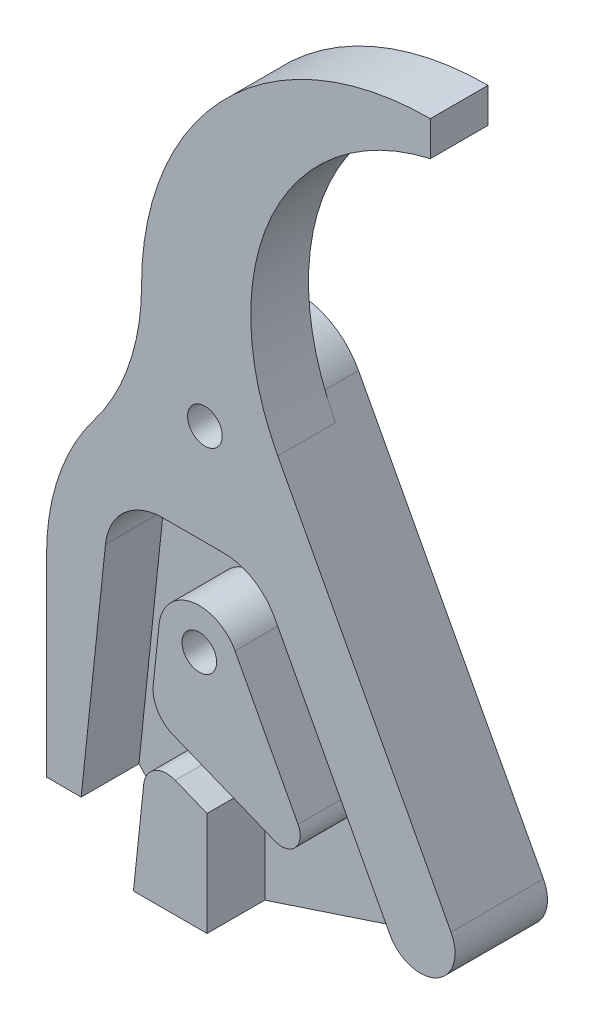
ISO-10303-21;
HEADER;
FILE_DESCRIPTION(('STEP AP214'),'2;1');
FILE_NAME('part.step','',(''),(''),'','','');
FILE_SCHEMA(('AUTOMOTIVE_DESIGN { 1 0 10303 214 1 1 1 1 }'));
ENDSEC;
DATA;
#1=APPLICATION_CONTEXT('core data for automotive mechanical design processes');
#2=APPLICATION_PROTOCOL_DEFINITION('international standard','automotive_design',2000,#1);
#3=PRODUCT_CONTEXT('',#1,'mechanical');
#4=PRODUCT('Part','Part','',(#3));
#5=PRODUCT_RELATED_PRODUCT_CATEGORY('part','',(#4));
#6=PRODUCT_DEFINITION_FORMATION('','',#4);
#7=PRODUCT_DEFINITION_CONTEXT('part definition',#1,'design');
#8=PRODUCT_DEFINITION('design','',#6,#7);
#9=PRODUCT_DEFINITION_SHAPE('','',#8);
#10=(LENGTH_UNIT() NAMED_UNIT(*) SI_UNIT(.MILLI.,.METRE.));
#11=(NAMED_UNIT(*) PLANE_ANGLE_UNIT() SI_UNIT($,.RADIAN.));
#12=(NAMED_UNIT(*) SI_UNIT($,.STERADIAN.) SOLID_ANGLE_UNIT());
#13=UNCERTAINTY_MEASURE_WITH_UNIT(LENGTH_MEASURE(1.E-05),#10,'distance_accuracy_value','');
#14=(GEOMETRIC_REPRESENTATION_CONTEXT(3) GLOBAL_UNCERTAINTY_ASSIGNED_CONTEXT((#13)) GLOBAL_UNIT_ASSIGNED_CONTEXT((#10,
#11,#12)) REPRESENTATION_CONTEXT('',''));
#15=CARTESIAN_POINT('',(0.,0.,0.));
#16=DIRECTION('',(0.,0.,1.));
#17=DIRECTION('',(1.,0.,0.));
#18=AXIS2_PLACEMENT_3D('',#15,#16,#17);
#19=CARTESIAN_POINT('',(30.4712966578612,15.,0.));
#20=DIRECTION('',(0.,0.,-1.));
#21=DIRECTION('',(-1.,0.,0.));
#22=AXIS2_PLACEMENT_3D('',#19,#20,#21);
#23=PLANE('',#22);
#24=CARTESIAN_POINT('',(11.3320826108303,26.5,0.));
#25=DIRECTION('',(0.,0.,1.));
#26=DIRECTION('',(1.,0.,0.));
#27=AXIS2_PLACEMENT_3D('',#24,#25,#26);
#28=CIRCLE('',#27,3.5);
#29=CARTESIAN_POINT('',(14.4223991858366,28.1431504697506,0.));
#30=VERTEX_POINT('',#29);
#31=CARTESIAN_POINT('',(7.85125597704136,26.8658496214368,0.));
#32=VERTEX_POINT('',#31);
#33=EDGE_CURVE('E257',#30,#32,#28,.T.);
#34=ORIENTED_EDGE('',*,*,#33,.F.);
#35=DIRECTION('',(-0.469471562785886,0.88294759285893,0.));
#36=VECTOR('',#35,1.);
#37=CARTESIAN_POINT('',(14.4223991858366,28.1431504697506,0.));
#38=LINE('',#37,#36);
#39=CARTESIAN_POINT('',(19.8836933846282,17.8719499350406,0.));
#40=VERTEX_POINT('',#39);
#41=EDGE_CURVE('E267',#40,#30,#38,.T.);
#42=ORIENTED_EDGE('',*,*,#41,.F.);
#43=CARTESIAN_POINT('',(18.4584820783574,17.1141516413858,0.));
#44=DIRECTION('',(0.,0.,1.));
#45=DIRECTION('',(1.,0.,0.));
#46=AXIS2_PLACEMENT_3D('',#43,#44,#45);
#47=CIRCLE('',#46,1.6141516413858);
#48=CARTESIAN_POINT('',(17.8538102307211,15.6175363006704,0.));
#49=VERTEX_POINT('',#48);
#50=EDGE_CURVE('E289',#49,#40,#47,.T.);
#51=ORIENTED_EDGE('',*,*,#50,.F.);
#52=DIRECTION('',(0.927183854566786,-0.374606593415916,0.));
#53=VECTOR('',#52,1.);
#54=CARTESIAN_POINT('',(17.8538102307211,15.6175363006704,0.));
#55=LINE('',#54,#53);
#56=CARTESIAN_POINT('',(9.04661425808038,19.1758744496871,0.));
#57=VERTEX_POINT('',#56);
#58=EDGE_CURVE('E286',#57,#49,#55,.T.);
#59=ORIENTED_EDGE('',*,*,#58,.F.);
#60=CARTESIAN_POINT('',(10.0771102647389,21.7264415682656,0.));
#61=DIRECTION('',(0.,0.,1.));
#62=DIRECTION('',(1.,0.,0.));
#63=AXIS2_PLACEMENT_3D('',#60,#61,#62);
#64=CIRCLE('',#63,2.75087525091795);
#65=CARTESIAN_POINT('',(7.34130459627432,22.013986330885,0.));
#66=VERTEX_POINT('',#65);
#67=EDGE_CURVE('E283',#66,#57,#64,.T.);
#68=ORIENTED_EDGE('',*,*,#67,.F.);
#69=DIRECTION('',(-0.104528463267653,-0.994521895368273,0.));
#70=VECTOR('',#69,1.);
#71=CARTESIAN_POINT('',(7.85125597704137,26.8658496214368,0.));
#72=LINE('',#71,#70);
#73=EDGE_CURVE('E280',#32,#66,#72,.T.);
#74=ORIENTED_EDGE('',*,*,#73,.F.);
#75=EDGE_LOOP('',(#34,#42,#51,#59,#68,#74));
#76=FACE_BOUND('',#75,.T.);
#77=DIRECTION('',(-0.104528463267654,-0.994521895368273,0.));
#78=VECTOR('',#77,1.);
#79=CARTESIAN_POINT('',(6.52097345992754,14.2090569265353,0.));
#80=LINE('',#79,#78);
#81=CARTESIAN_POINT('',(6.52097345992754,14.2090569265353,0.));
#82=VERTEX_POINT('',#81);
#83=CARTESIAN_POINT('',(5.63157805781336,5.74702492691116,0.));
#84=VERTEX_POINT('',#83);
#85=EDGE_CURVE('E48',#82,#84,#80,.T.);
#86=ORIENTED_EDGE('',*,*,#85,.F.);
#87=CARTESIAN_POINT('',(8.51001725066409,14.,0.));
#88=DIRECTION('',(0.,0.,1.));
#89=DIRECTION('',(-1.,0.,0.));
#90=AXIS2_PLACEMENT_3D('',#87,#88,#89);
#91=CIRCLE('',#90,2.);
#92=CARTESIAN_POINT('',(9.25923043749592,15.8543677091336,0.));
#93=VERTEX_POINT('',#92);
#94=EDGE_CURVE('E53',#93,#82,#91,.T.);
#95=ORIENTED_EDGE('',*,*,#94,.F.);
#96=DIRECTION('',(-0.927183854566786,0.374606593415915,0.));
#97=VECTOR('',#96,1.);
#98=CARTESIAN_POINT('',(9.25923043749592,15.8543677091336,0.));
#99=LINE('',#98,#97);
#100=CARTESIAN_POINT('',(12.,14.7470249269112,0.));
#101=VERTEX_POINT('',#100);
#102=EDGE_CURVE('E251',#101,#93,#99,.T.);
#103=ORIENTED_EDGE('',*,*,#102,.F.);
#104=DIRECTION('',(0.,1.,0.));
#105=VECTOR('',#104,1.);
#106=CARTESIAN_POINT('',(12.,14.7470249269112,0.));
#107=LINE('',#106,#105);
#108=CARTESIAN_POINT('',(12.,5.74702492691116,0.));
#109=VERTEX_POINT('',#108);
#110=EDGE_CURVE('E399',#109,#101,#107,.T.);
#111=ORIENTED_EDGE('',*,*,#110,.F.);
#112=DIRECTION('',(0.949653141005684,0.31330322656819,0.));
#113=VECTOR('',#112,1.);
#114=CARTESIAN_POINT('',(12.,5.74702492691116,0.));
#115=LINE('',#114,#113);
#116=CARTESIAN_POINT('',(31.4112063375657,12.151040576983,0.));
#117=VERTEX_POINT('',#116);
#118=EDGE_CURVE('E322',#109,#117,#115,.T.);
#119=ORIENTED_EDGE('',*,*,#118,.T.);
#120=CARTESIAN_POINT('',(30.4712966578612,15.,0.));
#121=DIRECTION('',(0.,0.,1.));
#122=DIRECTION('',(1.,0.,0.));
#123=AXIS2_PLACEMENT_3D('',#120,#121,#122);
#124=CIRCLE('',#123,3.);
#125=CARTESIAN_POINT('',(27.8224538792844,13.5915853116423,0.));
#126=VERTEX_POINT('',#125);
#127=EDGE_CURVE('E382',#126,#117,#124,.T.);
#128=ORIENTED_EDGE('',*,*,#127,.F.);
#129=DIRECTION('',(0.469471562785886,-0.88294759285893,0.));
#130=VECTOR('',#129,1.);
#131=CARTESIAN_POINT('',(17.8498327417214,32.3473578139294,0.));
#132=LINE('',#131,#130);
#133=CARTESIAN_POINT('',(17.8498327417214,32.3473578139294,0.));
#134=VERTEX_POINT('',#133);
#135=EDGE_CURVE('E589',#134,#126,#132,.T.);
#136=ORIENTED_EDGE('',*,*,#135,.F.);
#137=CARTESIAN_POINT('',(13.4350947774268,30.,0.));
#138=DIRECTION('',(0.,0.,-1.));
#139=DIRECTION('',(1.,0.,0.));
#140=AXIS2_PLACEMENT_3D('',#137,#138,#139);
#141=CIRCLE('',#140,4.99999999999998);
#142=CARTESIAN_POINT('',(13.4350947774268,35.,0.));
#143=VERTEX_POINT('',#142);
#144=EDGE_CURVE('E536',#143,#134,#141,.T.);
#145=ORIENTED_EDGE('',*,*,#144,.F.);
#146=DIRECTION('',(1.,0.,0.));
#147=VECTOR('',#146,1.);
#148=CARTESIAN_POINT('',(8.18066845578789,35.,0.));
#149=LINE('',#148,#147);
#150=CARTESIAN_POINT('',(8.18066845578789,35.,0.));
#151=VERTEX_POINT('',#150);
#152=EDGE_CURVE('E530',#151,#143,#149,.T.);
#153=ORIENTED_EDGE('',*,*,#152,.F.);
#154=CARTESIAN_POINT('',(8.18066845578789,30.,0.));
#155=DIRECTION('',(0.,0.,-1.));
#156=DIRECTION('',(1.,0.,0.));
#157=AXIS2_PLACEMENT_3D('',#154,#155,#156);
#158=CIRCLE('',#157,5.00000000000001);
#159=CARTESIAN_POINT('',(3.20805897894651,30.5226423163383,0.));
#160=VERTEX_POINT('',#159);
#161=EDGE_CURVE('E537',#160,#151,#158,.T.);
#162=ORIENTED_EDGE('',*,*,#161,.F.);
#163=DIRECTION('',(0.104528463267653,0.994521895368273,0.));
#164=VECTOR('',#163,1.);
#165=CARTESIAN_POINT('',(3.20805897894651,30.5226423163383,0.));
#166=LINE('',#165,#164);
#167=CARTESIAN_POINT('',(1.10597427363298,10.5226423163383,0.));
#168=VERTEX_POINT('',#167);
#169=EDGE_CURVE('E395',#168,#160,#166,.T.);
#170=ORIENTED_EDGE('',*,*,#169,.F.);
#171=DIRECTION('',(0.687851548760925,-0.72585139447906,0.));
#172=VECTOR('',#171,1.);
#173=CARTESIAN_POINT('',(1.10597427363298,10.5226423163383,0.));
#174=LINE('',#173,#172);
#175=EDGE_CURVE('E358',#168,#84,#174,.T.);
#176=ORIENTED_EDGE('',*,*,#175,.T.);
#177=EDGE_LOOP('',(#86,#95,#103,#111,#119,#128,#136,#145,#153,#162,#170,#176));
#178=FACE_BOUND('',#177,.T.);
#179=ADVANCED_FACE('F31',(#76,#178),#23,.F.);
#180=CARTESIAN_POINT('',(8.18066845578789,30.,5.));
#181=DIRECTION('',(0.,0.,1.));
#182=DIRECTION('',(1.,0.,0.));
#183=AXIS2_PLACEMENT_3D('',#180,#181,#182);
#184=PLANE('',#183);
#185=CARTESIAN_POINT('',(8.18066845578789,30.,5.));
#186=DIRECTION('',(0.,0.,-1.));
#187=DIRECTION('',(1.,0.,0.));
#188=AXIS2_PLACEMENT_3D('',#185,#186,#187);
#189=CIRCLE('',#188,5.00000000000001);
#190=CARTESIAN_POINT('',(3.20805897894651,30.5226423163383,5.));
#191=VERTEX_POINT('',#190);
#192=CARTESIAN_POINT('',(8.18066845578789,35.,5.));
#193=VERTEX_POINT('',#192);
#194=EDGE_CURVE('E560',#191,#193,#189,.T.);
#195=ORIENTED_EDGE('',*,*,#194,.T.);
#196=DIRECTION('',(1.,0.,0.));
#197=VECTOR('',#196,1.);
#198=CARTESIAN_POINT('',(8.18066845578789,35.,5.));
#199=LINE('',#198,#197);
#200=CARTESIAN_POINT('',(13.4350947774268,35.,5.));
#201=VERTEX_POINT('',#200);
#202=EDGE_CURVE('E635',#193,#201,#199,.T.);
#203=ORIENTED_EDGE('',*,*,#202,.T.);
#204=CARTESIAN_POINT('',(13.4350947774268,30.,5.));
#205=DIRECTION('',(0.,0.,-1.));
#206=DIRECTION('',(1.,0.,0.));
#207=AXIS2_PLACEMENT_3D('',#204,#205,#206);
#208=CIRCLE('',#207,4.99999999999998);
#209=CARTESIAN_POINT('',(17.8498327417214,32.3473578139294,5.));
#210=VERTEX_POINT('',#209);
#211=EDGE_CURVE('E542',#201,#210,#208,.T.);
#212=ORIENTED_EDGE('',*,*,#211,.T.);
#213=DIRECTION('',(0.469471562785886,-0.88294759285893,0.));
#214=VECTOR('',#213,1.);
#215=CARTESIAN_POINT('',(17.8498327417214,32.3473578139294,5.));
#216=LINE('',#215,#214);
#217=CARTESIAN_POINT('',(27.8224538792844,13.5915853116423,5.));
#218=VERTEX_POINT('',#217);
#219=EDGE_CURVE('E588',#210,#218,#216,.T.);
#220=ORIENTED_EDGE('',*,*,#219,.T.);
#221=CARTESIAN_POINT('',(30.4712966578612,15.,5.));
#222=DIRECTION('',(0.,0.,1.));
#223=DIRECTION('',(1.,0.,0.));
#224=AXIS2_PLACEMENT_3D('',#221,#222,#223);
#225=CIRCLE('',#224,3.);
#226=CARTESIAN_POINT('',(33.1201394364379,16.4084146883577,5.));
#227=VERTEX_POINT('',#226);
#228=EDGE_CURVE('E585',#218,#227,#225,.T.);
#229=ORIENTED_EDGE('',*,*,#228,.T.);
#230=DIRECTION('',(-0.469471562785886,0.88294759285893,0.));
#231=VECTOR('',#230,1.);
#232=CARTESIAN_POINT('',(33.1201394364379,16.4084146883577,5.));
#233=LINE('',#232,#231);
#234=CARTESIAN_POINT('',(18.1239704405625,44.6121065977072,5.));
#235=VERTEX_POINT('',#234);
#236=EDGE_CURVE('E640',#227,#235,#233,.T.);
#237=ORIENTED_EDGE('',*,*,#236,.T.);
#238=CARTESIAN_POINT('',(35.782922297741,54.0015378534249,5.));
#239=DIRECTION('',(0.,0.,-1.));
#240=DIRECTION('',(1.,0.,0.));
#241=AXIS2_PLACEMENT_3D('',#238,#239,#240);
#242=CIRCLE('',#241,20.);
#243=CARTESIAN_POINT('',(31.3320826108303,73.5,5.));
#244=VERTEX_POINT('',#243);
#245=EDGE_CURVE('E642',#235,#244,#242,.T.);
#246=ORIENTED_EDGE('',*,*,#245,.T.);
#247=DIRECTION('',(0.,1.,0.));
#248=VECTOR('',#247,1.);
#249=CARTESIAN_POINT('',(31.3320826108303,76.5,5.));
#250=LINE('',#249,#248);
#251=CARTESIAN_POINT('',(31.3320826108303,76.5,5.));
#252=VERTEX_POINT('',#251);
#253=EDGE_CURVE('E644',#244,#252,#250,.T.);
#254=ORIENTED_EDGE('',*,*,#253,.T.);
#255=CARTESIAN_POINT('',(31.3320826108303,51.5,5.));
#256=DIRECTION('',(0.,0.,1.));
#257=DIRECTION('',(1.,0.,0.));
#258=AXIS2_PLACEMENT_3D('',#255,#256,#257);
#259=CIRCLE('',#258,25.);
#260=CARTESIAN_POINT('',(6.33208261083033,51.5,5.));
#261=VERTEX_POINT('',#260);
#262=EDGE_CURVE('E621',#252,#261,#259,.T.);
#263=ORIENTED_EDGE('',*,*,#262,.T.);
#264=CARTESIAN_POINT('',(-13.6679173891697,51.5,5.));
#265=DIRECTION('',(0.,0.,-1.));
#266=DIRECTION('',(-1.,0.,0.));
#267=AXIS2_PLACEMENT_3D('',#264,#265,#266);
#268=CIRCLE('',#267,20.);
#269=CARTESIAN_POINT('',(2.21902844223166,39.3507221552012,5.));
#270=VERTEX_POINT('',#269);
#271=EDGE_CURVE('E601',#261,#270,#268,.T.);
#272=ORIENTED_EDGE('',*,*,#271,.T.);
#273=CARTESIAN_POINT('',(18.105974273633,27.2014443104023,5.));
#274=DIRECTION('',(0.,0.,1.));
#275=DIRECTION('',(1.,0.,0.));
#276=AXIS2_PLACEMENT_3D('',#273,#274,#275);
#277=CIRCLE('',#276,20.);
#278=CARTESIAN_POINT('',(-1.89402572636702,27.2014443104023,5.));
#279=VERTEX_POINT('',#278);
#280=EDGE_CURVE('E616',#270,#279,#277,.T.);
#281=ORIENTED_EDGE('',*,*,#280,.T.);
#282=DIRECTION('',(0.,-1.,0.));
#283=VECTOR('',#282,1.);
#284=CARTESIAN_POINT('',(-1.89402572636702,10.5226423163383,5.));
#285=LINE('',#284,#283);
#286=CARTESIAN_POINT('',(-1.89402572636702,10.5226423163383,5.));
#287=VERTEX_POINT('',#286);
#288=EDGE_CURVE('E617',#279,#287,#285,.T.);
#289=ORIENTED_EDGE('',*,*,#288,.T.);
#290=DIRECTION('',(1.,0.,0.));
#291=VECTOR('',#290,1.);
#292=CARTESIAN_POINT('',(1.10597427363298,10.5226423163383,5.));
#293=LINE('',#292,#291);
#294=CARTESIAN_POINT('',(1.10597427363298,10.5226423163383,5.));
#295=VERTEX_POINT('',#294);
#296=EDGE_CURVE('E619',#287,#295,#293,.T.);
#297=ORIENTED_EDGE('',*,*,#296,.T.);
#298=DIRECTION('',(0.104528463267653,0.994521895368273,0.));
#299=VECTOR('',#298,1.);
#300=CARTESIAN_POINT('',(3.20805897894651,30.5226423163383,5.));
#301=LINE('',#300,#299);
#302=EDGE_CURVE('E565',#295,#191,#301,.T.);
#303=ORIENTED_EDGE('',*,*,#302,.T.);
#304=EDGE_LOOP('',(#195,#203,#212,#220,#229,#237,#246,#254,#263,#272,#281,#289,#297,#303));
#305=FACE_BOUND('',#304,.T.);
#306=CARTESIAN_POINT('',(11.8173027115475,43.6928966946742,5.));
#307=DIRECTION('',(0.,0.,1.));
#308=DIRECTION('',(1.,0.,0.));
#309=AXIS2_PLACEMENT_3D('',#306,#307,#308);
#310=CIRCLE('',#309,1.5);
#311=CARTESIAN_POINT('',(13.3173027115475,43.6928966946742,5.));
#312=VERTEX_POINT('',#311);
#313=EDGE_CURVE('E387',#312,#312,#310,.T.);
#314=ORIENTED_EDGE('',*,*,#313,.F.);
#315=EDGE_LOOP('',(#314));
#316=FACE_BOUND('',#315,.T.);
#317=ADVANCED_FACE('F436',(#305,#316),#184,.T.);
#318=CARTESIAN_POINT('',(8.18066845578789,30.,0.));
#319=DIRECTION('',(0.,0.,1.));
#320=DIRECTION('',(1.,0.,0.));
#321=AXIS2_PLACEMENT_3D('',#318,#319,#320);
#322=PLANE('',#321);
#323=CARTESIAN_POINT('',(35.782922297741,54.0015378534249,0.));
#324=DIRECTION('',(0.,0.,-1.));
#325=DIRECTION('',(1.,0.,0.));
#326=AXIS2_PLACEMENT_3D('',#323,#324,#325);
#327=CIRCLE('',#326,20.);
#328=CARTESIAN_POINT('',(18.1239704405624,44.6121065977072,0.));
#329=VERTEX_POINT('',#328);
#330=CARTESIAN_POINT('',(31.3320826108303,73.5,0.));
#331=VERTEX_POINT('',#330);
#332=EDGE_CURVE('E379',#329,#331,#327,.T.);
#333=ORIENTED_EDGE('',*,*,#332,.F.);
#334=DIRECTION('',(-0.469471562785886,0.88294759285893,0.));
#335=VECTOR('',#334,1.);
#336=CARTESIAN_POINT('',(33.1201394364379,16.4084146883577,0.));
#337=LINE('',#336,#335);
#338=CARTESIAN_POINT('',(17.1149882687011,46.5097260713895,0.));
#339=VERTEX_POINT('',#338);
#340=EDGE_CURVE('E11',#329,#339,#337,.T.);
#341=ORIENTED_EDGE('',*,*,#340,.T.);
#342=CARTESIAN_POINT('',(11.8173027115475,43.6928966946742,0.));
#343=DIRECTION('',(0.,0.,1.));
#344=DIRECTION('',(1.,0.,0.));
#345=AXIS2_PLACEMENT_3D('',#342,#343,#344);
#346=CIRCLE('',#345,6.);
#347=CARTESIAN_POINT('',(6.60823736293363,46.6704188514129,0.));
#348=VERTEX_POINT('',#347);
#349=EDGE_CURVE('E317',#339,#348,#346,.T.);
#350=ORIENTED_EDGE('',*,*,#349,.T.);
#351=DIRECTION('',(-0.496253692789786,-0.868177558102316,0.));
#352=VECTOR('',#351,1.);
#353=CARTESIAN_POINT('',(3.69563377287666,41.5749261442043,0.));
#354=LINE('',#353,#352);
#355=CARTESIAN_POINT('',(3.69563377287664,41.5749261442043,0.));
#356=VERTEX_POINT('',#355);
#357=EDGE_CURVE('E355',#348,#356,#354,.T.);
#358=ORIENTED_EDGE('',*,*,#357,.T.);
#359=CARTESIAN_POINT('',(-13.6679173891697,51.5,0.));
#360=DIRECTION('',(0.,0.,-1.));
#361=DIRECTION('',(-1.,0.,0.));
#362=AXIS2_PLACEMENT_3D('',#359,#360,#361);
#363=CIRCLE('',#362,20.);
#364=CARTESIAN_POINT('',(6.33208261083033,51.5,0.));
#365=VERTEX_POINT('',#364);
#366=EDGE_CURVE('E550',#365,#356,#363,.T.);
#367=ORIENTED_EDGE('',*,*,#366,.F.);
#368=CARTESIAN_POINT('',(31.3320826108303,51.5,0.));
#369=DIRECTION('',(0.,0.,1.));
#370=DIRECTION('',(1.,0.,0.));
#371=AXIS2_PLACEMENT_3D('',#368,#369,#370);
#372=CIRCLE('',#371,25.);
#373=CARTESIAN_POINT('',(31.3320826108303,76.5,0.));
#374=VERTEX_POINT('',#373);
#375=EDGE_CURVE('E553',#374,#365,#372,.T.);
#376=ORIENTED_EDGE('',*,*,#375,.F.);
#377=DIRECTION('',(0.,1.,0.));
#378=VECTOR('',#377,1.);
#379=CARTESIAN_POINT('',(31.3320826108303,76.5,0.));
#380=LINE('',#379,#378);
#381=EDGE_CURVE('E381',#331,#374,#380,.T.);
#382=ORIENTED_EDGE('',*,*,#381,.F.);
#383=EDGE_LOOP('',(#333,#341,#350,#358,#367,#376,#382));
#384=FACE_BOUND('',#383,.T.);
#385=ADVANCED_FACE('F442',(#384),#322,.F.);
#386=CARTESIAN_POINT('',(8.18066845578789,30.,5.));
#387=DIRECTION('',(0.,0.,-1.));
#388=DIRECTION('',(-1.,0.,0.));
#389=AXIS2_PLACEMENT_3D('',#386,#387,#388);
#390=CYLINDRICAL_SURFACE('',#389,5.00000000000001);
#391=ORIENTED_EDGE('',*,*,#161,.T.);
#392=DIRECTION('',(0.,0.,-1.));
#393=VECTOR('',#392,1.);
#394=CARTESIAN_POINT('',(8.18066845578789,35.,5.));
#395=LINE('',#394,#393);
#396=EDGE_CURVE('E40',#193,#151,#395,.T.);
#397=ORIENTED_EDGE('',*,*,#396,.F.);
#398=ORIENTED_EDGE('',*,*,#194,.F.);
#399=DIRECTION('',(0.,0.,-1.));
#400=VECTOR('',#399,1.);
#401=CARTESIAN_POINT('',(3.20805897894651,30.5226423163383,5.));
#402=LINE('',#401,#400);
#403=EDGE_CURVE('E561',#191,#160,#402,.T.);
#404=ORIENTED_EDGE('',*,*,#403,.T.);
#405=EDGE_LOOP('',(#391,#397,#398,#404));
#406=FACE_BOUND('',#405,.T.);
#407=ADVANCED_FACE('F33',(#406),#390,.F.);
#408=CARTESIAN_POINT('',(8.18066845578789,35.,5.));
#409=DIRECTION('',(0.,1.,0.));
#410=DIRECTION('',(0.,0.,1.));
#411=AXIS2_PLACEMENT_3D('',#408,#409,#410);
#412=PLANE('',#411);
#413=ORIENTED_EDGE('',*,*,#152,.T.);
#414=DIRECTION('',(0.,0.,-1.));
#415=VECTOR('',#414,1.);
#416=CARTESIAN_POINT('',(13.4350947774268,35.,5.));
#417=LINE('',#416,#415);
#418=EDGE_CURVE('E532',#201,#143,#417,.T.);
#419=ORIENTED_EDGE('',*,*,#418,.F.);
#420=ORIENTED_EDGE('',*,*,#202,.F.);
#421=ORIENTED_EDGE('',*,*,#396,.T.);
#422=EDGE_LOOP('',(#413,#419,#420,#421));
#423=FACE_BOUND('',#422,.T.);
#424=ADVANCED_FACE('F519',(#423),#412,.F.);
#425=CARTESIAN_POINT('',(13.4350947774268,30.,5.));
#426=DIRECTION('',(0.,0.,-1.));
#427=DIRECTION('',(-1.,0.,0.));
#428=AXIS2_PLACEMENT_3D('',#425,#426,#427);
#429=CYLINDRICAL_SURFACE('',#428,4.99999999999998);
#430=ORIENTED_EDGE('',*,*,#144,.T.);
#431=DIRECTION('',(0.,0.,-1.));
#432=VECTOR('',#431,1.);
#433=CARTESIAN_POINT('',(17.8498327417214,32.3473578139294,5.));
#434=LINE('',#433,#432);
#435=EDGE_CURVE('E543',#210,#134,#434,.T.);
#436=ORIENTED_EDGE('',*,*,#435,.F.);
#437=ORIENTED_EDGE('',*,*,#211,.F.);
#438=ORIENTED_EDGE('',*,*,#418,.T.);
#439=EDGE_LOOP('',(#430,#436,#437,#438));
#440=FACE_BOUND('',#439,.T.);
#441=ADVANCED_FACE('F516',(#440),#429,.F.);
#442=CARTESIAN_POINT('',(17.8498327417214,32.3473578139294,5.));
#443=DIRECTION('',(0.88294759285893,0.469471562785886,0.));
#444=DIRECTION('',(-0.469471562785886,0.88294759285893,0.));
#445=AXIS2_PLACEMENT_3D('',#442,#443,#444);
#446=PLANE('',#445);
#447=ORIENTED_EDGE('',*,*,#135,.T.);
#448=DIRECTION('',(0.,0.,-1.));
#449=VECTOR('',#448,1.);
#450=CARTESIAN_POINT('',(27.8224538792844,13.5915853116423,5.));
#451=LINE('',#450,#449);
#452=EDGE_CURVE('E546',#218,#126,#451,.T.);
#453=ORIENTED_EDGE('',*,*,#452,.F.);
#454=ORIENTED_EDGE('',*,*,#219,.F.);
#455=ORIENTED_EDGE('',*,*,#435,.T.);
#456=EDGE_LOOP('',(#447,#453,#454,#455));
#457=FACE_BOUND('',#456,.T.);
#458=ADVANCED_FACE('F512',(#457),#446,.F.);
#459=CARTESIAN_POINT('',(30.4712966578612,15.,5.));
#460=DIRECTION('',(0.,0.,-1.));
#461=DIRECTION('',(-1.,0.,0.));
#462=AXIS2_PLACEMENT_3D('',#459,#460,#461);
#463=CYLINDRICAL_SURFACE('',#462,3.);
#464=ORIENTED_EDGE('',*,*,#127,.T.);
#465=DIRECTION('',(0.,0.,1.));
#466=VECTOR('',#465,1.);
#467=CARTESIAN_POINT('',(31.4112063375657,12.151040576983,-3.));
#468=LINE('',#467,#466);
#469=CARTESIAN_POINT('',(31.4112063375657,12.151040576983,-3.));
#470=VERTEX_POINT('',#469);
#471=EDGE_CURVE('E385',#470,#117,#468,.T.);
#472=ORIENTED_EDGE('',*,*,#471,.F.);
#473=CARTESIAN_POINT('',(30.4712966578612,15.,-3.));
#474=DIRECTION('',(0.,0.,1.));
#475=DIRECTION('',(-1.,0.,0.));
#476=AXIS2_PLACEMENT_3D('',#473,#474,#475);
#477=CIRCLE('',#476,3.);
#478=CARTESIAN_POINT('',(33.1201394364379,16.4084146883577,-3.));
#479=VERTEX_POINT('',#478);
#480=EDGE_CURVE('E318',#470,#479,#477,.T.);
#481=ORIENTED_EDGE('',*,*,#480,.T.);
#482=DIRECTION('',(0.,0.,-1.));
#483=VECTOR('',#482,1.);
#484=CARTESIAN_POINT('',(33.1201394364379,16.4084146883577,5.));
#485=LINE('',#484,#483);
#486=EDGE_CURVE('E375',#227,#479,#485,.T.);
#487=ORIENTED_EDGE('',*,*,#486,.F.);
#488=ORIENTED_EDGE('',*,*,#228,.F.);
#489=ORIENTED_EDGE('',*,*,#452,.T.);
#490=EDGE_LOOP('',(#464,#472,#481,#487,#488,#489));
#491=FACE_BOUND('',#490,.T.);
#492=ADVANCED_FACE('F508',(#491),#463,.T.);
#493=CARTESIAN_POINT('',(33.1201394364379,16.4084146883577,5.));
#494=DIRECTION('',(-0.88294759285893,-0.469471562785886,0.));
#495=DIRECTION('',(0.469471562785886,-0.88294759285893,0.));
#496=AXIS2_PLACEMENT_3D('',#493,#494,#495);
#497=PLANE('',#496);
#498=ORIENTED_EDGE('',*,*,#486,.T.);
#499=DIRECTION('',(-0.469471562785886,0.88294759285893,0.));
#500=VECTOR('',#499,1.);
#501=CARTESIAN_POINT('',(33.1201394364379,16.4084146883577,-3.));
#502=LINE('',#501,#500);
#503=CARTESIAN_POINT('',(17.1149882687011,46.5097260713895,-3.));
#504=VERTEX_POINT('',#503);
#505=EDGE_CURVE('E321',#479,#504,#502,.T.);
#506=ORIENTED_EDGE('',*,*,#505,.T.);
#507=DIRECTION('',(0.,0.,1.));
#508=VECTOR('',#507,1.);
#509=CARTESIAN_POINT('',(17.1149882687011,46.5097260713895,-3.));
#510=LINE('',#509,#508);
#511=EDGE_CURVE('E352',#504,#339,#510,.T.);
#512=ORIENTED_EDGE('',*,*,#511,.T.);
#513=ORIENTED_EDGE('',*,*,#340,.F.);
#514=DIRECTION('',(0.,0.,-1.));
#515=VECTOR('',#514,1.);
#516=CARTESIAN_POINT('',(18.1239704405625,44.6121065977072,5.));
#517=LINE('',#516,#515);
#518=EDGE_CURVE('E372',#235,#329,#517,.T.);
#519=ORIENTED_EDGE('',*,*,#518,.F.);
#520=ORIENTED_EDGE('',*,*,#236,.F.);
#521=EDGE_LOOP('',(#498,#506,#512,#513,#519,#520));
#522=FACE_BOUND('',#521,.T.);
#523=ADVANCED_FACE('F504',(#522),#497,.F.);
#524=CARTESIAN_POINT('',(35.782922297741,54.0015378534249,5.));
#525=DIRECTION('',(0.,0.,-1.));
#526=DIRECTION('',(-1.,0.,0.));
#527=AXIS2_PLACEMENT_3D('',#524,#525,#526);
#528=CYLINDRICAL_SURFACE('',#527,20.);
#529=ORIENTED_EDGE('',*,*,#332,.T.);
#530=DIRECTION('',(0.,0.,-1.));
#531=VECTOR('',#530,1.);
#532=CARTESIAN_POINT('',(31.3320826108303,73.5,5.));
#533=LINE('',#532,#531);
#534=EDGE_CURVE('E376',#244,#331,#533,.T.);
#535=ORIENTED_EDGE('',*,*,#534,.F.);
#536=ORIENTED_EDGE('',*,*,#245,.F.);
#537=ORIENTED_EDGE('',*,*,#518,.T.);
#538=EDGE_LOOP('',(#529,#535,#536,#537));
#539=FACE_BOUND('',#538,.T.);
#540=ADVANCED_FACE('F500',(#539),#528,.F.);
#541=CARTESIAN_POINT('',(31.3320826108303,76.5,5.));
#542=DIRECTION('',(-1.,0.,0.));
#543=DIRECTION('',(0.,-1.,0.));
#544=AXIS2_PLACEMENT_3D('',#541,#542,#543);
#545=PLANE('',#544);
#546=ORIENTED_EDGE('',*,*,#381,.T.);
#547=DIRECTION('',(0.,0.,-1.));
#548=VECTOR('',#547,1.);
#549=CARTESIAN_POINT('',(31.3320826108303,76.5,5.));
#550=LINE('',#549,#548);
#551=EDGE_CURVE('E576',#252,#374,#550,.T.);
#552=ORIENTED_EDGE('',*,*,#551,.F.);
#553=ORIENTED_EDGE('',*,*,#253,.F.);
#554=ORIENTED_EDGE('',*,*,#534,.T.);
#555=EDGE_LOOP('',(#546,#552,#553,#554));
#556=FACE_BOUND('',#555,.T.);
#557=ADVANCED_FACE('F496',(#556),#545,.F.);
#558=CARTESIAN_POINT('',(31.3320826108303,51.5,5.));
#559=DIRECTION('',(0.,0.,-1.));
#560=DIRECTION('',(-1.,0.,0.));
#561=AXIS2_PLACEMENT_3D('',#558,#559,#560);
#562=CYLINDRICAL_SURFACE('',#561,25.);
#563=ORIENTED_EDGE('',*,*,#375,.T.);
#564=DIRECTION('',(0.,0.,-1.));
#565=VECTOR('',#564,1.);
#566=CARTESIAN_POINT('',(6.33208261083033,51.5,5.));
#567=LINE('',#566,#565);
#568=EDGE_CURVE('E573',#261,#365,#567,.T.);
#569=ORIENTED_EDGE('',*,*,#568,.F.);
#570=ORIENTED_EDGE('',*,*,#262,.F.);
#571=ORIENTED_EDGE('',*,*,#551,.T.);
#572=EDGE_LOOP('',(#563,#569,#570,#571));
#573=FACE_BOUND('',#572,.T.);
#574=ADVANCED_FACE('F492',(#573),#562,.T.);
#575=CARTESIAN_POINT('',(-13.6679173891697,51.5,5.));
#576=DIRECTION('',(0.,0.,-1.));
#577=DIRECTION('',(-1.,0.,0.));
#578=AXIS2_PLACEMENT_3D('',#575,#576,#577);
#579=CYLINDRICAL_SURFACE('',#578,20.);
#580=ORIENTED_EDGE('',*,*,#366,.T.);
#581=DIRECTION('',(0.,0.,1.));
#582=VECTOR('',#581,1.);
#583=CARTESIAN_POINT('',(3.69563377287665,41.5749261442043,-3.));
#584=LINE('',#583,#582);
#585=CARTESIAN_POINT('',(3.69563377287665,41.5749261442043,-3.));
#586=VERTEX_POINT('',#585);
#587=EDGE_CURVE('E366',#586,#356,#584,.T.);
#588=ORIENTED_EDGE('',*,*,#587,.F.);
#589=CARTESIAN_POINT('',(-13.6679173891697,51.5,-3.));
#590=DIRECTION('',(0.,0.,-1.));
#591=DIRECTION('',(1.,0.,0.));
#592=AXIS2_PLACEMENT_3D('',#589,#590,#591);
#593=CIRCLE('',#592,20.);
#594=CARTESIAN_POINT('',(2.21902844223165,39.3507221552012,-3.));
#595=VERTEX_POINT('',#594);
#596=EDGE_CURVE('E331',#586,#595,#593,.T.);
#597=ORIENTED_EDGE('',*,*,#596,.T.);
#598=DIRECTION('',(0.,0.,-1.));
#599=VECTOR('',#598,1.);
#600=CARTESIAN_POINT('',(2.21902844223166,39.3507221552012,5.));
#601=LINE('',#600,#599);
#602=EDGE_CURVE('E571',#270,#595,#601,.T.);
#603=ORIENTED_EDGE('',*,*,#602,.F.);
#604=ORIENTED_EDGE('',*,*,#271,.F.);
#605=ORIENTED_EDGE('',*,*,#568,.T.);
#606=EDGE_LOOP('',(#580,#588,#597,#603,#604,#605));
#607=FACE_BOUND('',#606,.T.);
#608=ADVANCED_FACE('F488',(#607),#579,.F.);
#609=CARTESIAN_POINT('',(18.105974273633,27.2014443104023,5.));
#610=DIRECTION('',(0.,0.,-1.));
#611=DIRECTION('',(-1.,0.,0.));
#612=AXIS2_PLACEMENT_3D('',#609,#610,#611);
#613=CYLINDRICAL_SURFACE('',#612,20.);
#614=ORIENTED_EDGE('',*,*,#602,.T.);
#615=CARTESIAN_POINT('',(18.105974273633,27.2014443104023,-3.));
#616=DIRECTION('',(0.,0.,1.));
#617=DIRECTION('',(1.,0.,0.));
#618=AXIS2_PLACEMENT_3D('',#615,#616,#617);
#619=CIRCLE('',#618,20.);
#620=CARTESIAN_POINT('',(-1.89402572636702,27.2014443104023,-3.));
#621=VERTEX_POINT('',#620);
#622=EDGE_CURVE('E334',#595,#621,#619,.T.);
#623=ORIENTED_EDGE('',*,*,#622,.T.);
#624=DIRECTION('',(0.,0.,-1.));
#625=VECTOR('',#624,1.);
#626=CARTESIAN_POINT('',(-1.89402572636702,27.2014443104023,5.));
#627=LINE('',#626,#625);
#628=EDGE_CURVE('E569',#279,#621,#627,.T.);
#629=ORIENTED_EDGE('',*,*,#628,.F.);
#630=ORIENTED_EDGE('',*,*,#280,.F.);
#631=EDGE_LOOP('',(#614,#623,#629,#630));
#632=FACE_BOUND('',#631,.T.);
#633=ADVANCED_FACE('F484',(#632),#613,.T.);
#634=CARTESIAN_POINT('',(-1.89402572636702,10.5226423163383,5.));
#635=DIRECTION('',(1.,0.,0.));
#636=DIRECTION('',(0.,1.,0.));
#637=AXIS2_PLACEMENT_3D('',#634,#635,#636);
#638=PLANE('',#637);
#639=ORIENTED_EDGE('',*,*,#628,.T.);
#640=DIRECTION('',(0.,-1.,0.));
#641=VECTOR('',#640,1.);
#642=CARTESIAN_POINT('',(-1.89402572636702,10.5226423163383,-3.));
#643=LINE('',#642,#641);
#644=CARTESIAN_POINT('',(-1.89402572636702,10.5226423163383,-3.));
#645=VERTEX_POINT('',#644);
#646=EDGE_CURVE('E337',#621,#645,#643,.T.);
#647=ORIENTED_EDGE('',*,*,#646,.T.);
#648=DIRECTION('',(0.,0.,-1.));
#649=VECTOR('',#648,1.);
#650=CARTESIAN_POINT('',(-1.89402572636702,10.5226423163383,5.));
#651=LINE('',#650,#649);
#652=EDGE_CURVE('E567',#287,#645,#651,.T.);
#653=ORIENTED_EDGE('',*,*,#652,.F.);
#654=ORIENTED_EDGE('',*,*,#288,.F.);
#655=EDGE_LOOP('',(#639,#647,#653,#654));
#656=FACE_BOUND('',#655,.T.);
#657=ADVANCED_FACE('F480',(#656),#638,.F.);
#658=CARTESIAN_POINT('',(1.10597427363298,10.5226423163383,5.));
#659=DIRECTION('',(0.,1.,0.));
#660=DIRECTION('',(-1.,0.,0.));
#661=AXIS2_PLACEMENT_3D('',#658,#659,#660);
#662=PLANE('',#661);
#663=ORIENTED_EDGE('',*,*,#652,.T.);
#664=DIRECTION('',(1.,0.,0.));
#665=VECTOR('',#664,1.);
#666=CARTESIAN_POINT('',(1.10597427363298,10.5226423163383,-3.));
#667=LINE('',#666,#665);
#668=CARTESIAN_POINT('',(1.10597427363298,10.5226423163383,-3.));
#669=VERTEX_POINT('',#668);
#670=EDGE_CURVE('E340',#645,#669,#667,.T.);
#671=ORIENTED_EDGE('',*,*,#670,.T.);
#672=DIRECTION('',(0.,0.,1.));
#673=VECTOR('',#672,1.);
#674=CARTESIAN_POINT('',(1.10597427363298,10.5226423163383,-3.));
#675=LINE('',#674,#673);
#676=EDGE_CURVE('E368',#669,#168,#675,.T.);
#677=ORIENTED_EDGE('',*,*,#676,.T.);
#678=DIRECTION('',(0.,0.,-1.));
#679=VECTOR('',#678,1.);
#680=CARTESIAN_POINT('',(1.10597427363298,10.5226423163383,5.));
#681=LINE('',#680,#679);
#682=EDGE_CURVE('E564',#295,#168,#681,.T.);
#683=ORIENTED_EDGE('',*,*,#682,.F.);
#684=ORIENTED_EDGE('',*,*,#296,.F.);
#685=EDGE_LOOP('',(#663,#671,#677,#683,#684));
#686=FACE_BOUND('',#685,.T.);
#687=ADVANCED_FACE('F476',(#686),#662,.F.);
#688=CARTESIAN_POINT('',(3.20805897894651,30.5226423163383,5.));
#689=DIRECTION('',(-0.994521895368273,0.104528463267653,0.));
#690=DIRECTION('',(-0.104528463267653,-0.994521895368273,0.));
#691=AXIS2_PLACEMENT_3D('',#688,#689,#690);
#692=PLANE('',#691);
#693=ORIENTED_EDGE('',*,*,#169,.T.);
#694=ORIENTED_EDGE('',*,*,#403,.F.);
#695=ORIENTED_EDGE('',*,*,#302,.F.);
#696=ORIENTED_EDGE('',*,*,#682,.T.);
#697=EDGE_LOOP('',(#693,#694,#695,#696));
#698=FACE_BOUND('',#697,.T.);
#699=ADVANCED_FACE('F468',(#698),#692,.F.);
#700=CARTESIAN_POINT('',(11.8173027115475,43.6928966946742,5.));
#701=DIRECTION('',(0.,0.,-1.));
#702=DIRECTION('',(-1.,0.,0.));
#703=AXIS2_PLACEMENT_3D('',#700,#701,#702);
#704=CYLINDRICAL_SURFACE('',#703,1.5);
#705=ORIENTED_EDGE('',*,*,#313,.T.);
#706=EDGE_LOOP('',(#705));
#707=FACE_BOUND('',#706,.T.);
#708=CARTESIAN_POINT('',(11.8173027115475,43.6928966946742,-3.));
#709=DIRECTION('',(0.,0.,1.));
#710=DIRECTION('',(1.,0.,0.));
#711=AXIS2_PLACEMENT_3D('',#708,#709,#710);
#712=CIRCLE('',#711,1.5);
#713=CARTESIAN_POINT('',(13.3173027115475,43.6928966946742,-3.));
#714=VERTEX_POINT('',#713);
#715=EDGE_CURVE('E311',#714,#714,#712,.T.);
#716=ORIENTED_EDGE('',*,*,#715,.F.);
#717=EDGE_LOOP('',(#716));
#718=FACE_BOUND('',#717,.T.);
#719=ADVANCED_FACE('F452',(#707,#718),#704,.F.);
#720=CARTESIAN_POINT('',(12.,5.74702492691116,-3.));
#721=DIRECTION('',(0.31330322656819,-0.949653141005684,0.));
#722=DIRECTION('',(0.949653141005684,0.31330322656819,0.));
#723=AXIS2_PLACEMENT_3D('',#720,#721,#722);
#724=PLANE('',#723);
#725=ORIENTED_EDGE('',*,*,#118,.F.);
#726=DIRECTION('',(0.,0.,1.));
#727=VECTOR('',#726,1.);
#728=CARTESIAN_POINT('',(12.,5.74702492691116,-3.));
#729=LINE('',#728,#727);
#730=CARTESIAN_POINT('',(12.,5.74702492691116,-3.));
#731=VERTEX_POINT('',#730);
#732=EDGE_CURVE('E388',#731,#109,#729,.T.);
#733=ORIENTED_EDGE('',*,*,#732,.F.);
#734=DIRECTION('',(0.949653141005684,0.31330322656819,0.));
#735=VECTOR('',#734,1.);
#736=CARTESIAN_POINT('',(12.,5.74702492691116,-3.));
#737=LINE('',#736,#735);
#738=EDGE_CURVE('E349',#731,#470,#737,.T.);
#739=ORIENTED_EDGE('',*,*,#738,.T.);
#740=ORIENTED_EDGE('',*,*,#471,.T.);
#741=EDGE_LOOP('',(#725,#733,#739,#740));
#742=FACE_BOUND('',#741,.T.);
#743=ADVANCED_FACE('F449',(#742),#724,.T.);
#744=CARTESIAN_POINT('',(12.,5.74702492691116,-3.));
#745=DIRECTION('',(0.,-1.,0.));
#746=DIRECTION('',(0.,0.,-1.));
#747=AXIS2_PLACEMENT_3D('',#744,#745,#746);
#748=PLANE('',#747);
#749=ORIENTED_EDGE('',*,*,#732,.T.);
#750=DIRECTION('',(0.,0.,-1.));
#751=VECTOR('',#750,1.);
#752=CARTESIAN_POINT('',(12.,5.74702492691116,5.));
#753=LINE('',#752,#751);
#754=CARTESIAN_POINT('',(12.,5.74702492691116,5.));
#755=VERTEX_POINT('',#754);
#756=EDGE_CURVE('E259',#755,#109,#753,.T.);
#757=ORIENTED_EDGE('',*,*,#756,.F.);
#758=DIRECTION('',(1.,0.,0.));
#759=VECTOR('',#758,1.);
#760=CARTESIAN_POINT('',(12.,5.74702492691116,5.));
#761=LINE('',#760,#759);
#762=CARTESIAN_POINT('',(5.63157805781336,5.74702492691116,5.));
#763=VERTEX_POINT('',#762);
#764=EDGE_CURVE('E241',#763,#755,#761,.T.);
#765=ORIENTED_EDGE('',*,*,#764,.F.);
#766=DIRECTION('',(0.,0.,-1.));
#767=VECTOR('',#766,1.);
#768=CARTESIAN_POINT('',(5.63157805781336,5.74702492691116,5.));
#769=LINE('',#768,#767);
#770=EDGE_CURVE('E238',#763,#84,#769,.T.);
#771=ORIENTED_EDGE('',*,*,#770,.T.);
#772=DIRECTION('',(0.,0.,1.));
#773=VECTOR('',#772,1.);
#774=CARTESIAN_POINT('',(5.63157805781336,5.74702492691116,-3.));
#775=LINE('',#774,#773);
#776=CARTESIAN_POINT('',(5.63157805781336,5.74702492691116,-3.));
#777=VERTEX_POINT('',#776);
#778=EDGE_CURVE('E404',#777,#84,#775,.T.);
#779=ORIENTED_EDGE('',*,*,#778,.F.);
#780=DIRECTION('',(1.,0.,0.));
#781=VECTOR('',#780,1.);
#782=CARTESIAN_POINT('',(12.,5.74702492691116,-3.));
#783=LINE('',#782,#781);
#784=EDGE_CURVE('E346',#777,#731,#783,.T.);
#785=ORIENTED_EDGE('',*,*,#784,.T.);
#786=EDGE_LOOP('',(#749,#757,#765,#771,#779,#785));
#787=FACE_BOUND('',#786,.T.);
#788=ADVANCED_FACE('F403',(#787),#748,.T.);
#789=CARTESIAN_POINT('',(1.10597427363298,10.5226423163383,-3.));
#790=DIRECTION('',(-0.725851394479061,-0.687851548760925,0.));
#791=DIRECTION('',(0.687851548760925,-0.725851394479061,0.));
#792=AXIS2_PLACEMENT_3D('',#789,#790,#791);
#793=PLANE('',#792);
#794=ORIENTED_EDGE('',*,*,#175,.F.);
#795=ORIENTED_EDGE('',*,*,#676,.F.);
#796=DIRECTION('',(0.687851548760925,-0.72585139447906,0.));
#797=VECTOR('',#796,1.);
#798=CARTESIAN_POINT('',(1.10597427363298,10.5226423163383,-3.));
#799=LINE('',#798,#797);
#800=EDGE_CURVE('E343',#669,#777,#799,.T.);
#801=ORIENTED_EDGE('',*,*,#800,.T.);
#802=ORIENTED_EDGE('',*,*,#778,.T.);
#803=EDGE_LOOP('',(#794,#795,#801,#802));
#804=FACE_BOUND('',#803,.T.);
#805=ADVANCED_FACE('F456',(#804),#793,.T.);
#806=CARTESIAN_POINT('',(3.69563377287666,41.5749261442043,-3.));
#807=DIRECTION('',(-0.868177558102316,0.496253692789786,0.));
#808=DIRECTION('',(-0.496253692789786,-0.868177558102316,0.));
#809=AXIS2_PLACEMENT_3D('',#806,#807,#808);
#810=PLANE('',#809);
#811=ORIENTED_EDGE('',*,*,#357,.F.);
#812=DIRECTION('',(0.,0.,1.));
#813=VECTOR('',#812,1.);
#814=CARTESIAN_POINT('',(6.60823736293363,46.6704188514129,-3.));
#815=LINE('',#814,#813);
#816=CARTESIAN_POINT('',(6.60823736293363,46.6704188514129,-3.));
#817=VERTEX_POINT('',#816);
#818=EDGE_CURVE('E369',#817,#348,#815,.T.);
#819=ORIENTED_EDGE('',*,*,#818,.F.);
#820=DIRECTION('',(-0.496253692789786,-0.868177558102316,0.));
#821=VECTOR('',#820,1.);
#822=CARTESIAN_POINT('',(3.69563377287666,41.5749261442043,-3.));
#823=LINE('',#822,#821);
#824=EDGE_CURVE('E328',#817,#586,#823,.T.);
#825=ORIENTED_EDGE('',*,*,#824,.T.);
#826=ORIENTED_EDGE('',*,*,#587,.T.);
#827=EDGE_LOOP('',(#811,#819,#825,#826));
#828=FACE_BOUND('',#827,.T.);
#829=ADVANCED_FACE('F459',(#828),#810,.T.);
#830=CARTESIAN_POINT('',(11.8173027115475,43.6928966946742,-3.));
#831=DIRECTION('',(0.,0.,1.));
#832=DIRECTION('',(1.,0.,0.));
#833=AXIS2_PLACEMENT_3D('',#830,#831,#832);
#834=CYLINDRICAL_SURFACE('',#833,6.);
#835=ORIENTED_EDGE('',*,*,#349,.F.);
#836=ORIENTED_EDGE('',*,*,#511,.F.);
#837=CARTESIAN_POINT('',(11.8173027115475,43.6928966946742,-3.));
#838=DIRECTION('',(0.,0.,1.));
#839=DIRECTION('',(1.,0.,0.));
#840=AXIS2_PLACEMENT_3D('',#837,#838,#839);
#841=CIRCLE('',#840,6.);
#842=EDGE_CURVE('E325',#504,#817,#841,.T.);
#843=ORIENTED_EDGE('',*,*,#842,.T.);
#844=ORIENTED_EDGE('',*,*,#818,.T.);
#845=EDGE_LOOP('',(#835,#836,#843,#844));
#846=FACE_BOUND('',#845,.T.);
#847=ADVANCED_FACE('F462',(#846),#834,.T.);
#848=CARTESIAN_POINT('',(30.4712966578612,15.,-3.));
#849=DIRECTION('',(0.,0.,-1.));
#850=DIRECTION('',(-1.,0.,0.));
#851=AXIS2_PLACEMENT_3D('',#848,#849,#850);
#852=PLANE('',#851);
#853=ORIENTED_EDGE('',*,*,#715,.T.);
#854=EDGE_LOOP('',(#853));
#855=FACE_BOUND('',#854,.T.);
#856=CARTESIAN_POINT('',(11.3320826108303,26.5,-3.));
#857=DIRECTION('',(0.,0.,1.));
#858=DIRECTION('',(1.,0.,0.));
#859=AXIS2_PLACEMENT_3D('',#856,#857,#858);
#860=CIRCLE('',#859,1.5);
#861=CARTESIAN_POINT('',(12.8320826108303,26.5,-3.));
#862=VERTEX_POINT('',#861);
#863=EDGE_CURVE('E314',#862,#862,#860,.T.);
#864=ORIENTED_EDGE('',*,*,#863,.T.);
#865=EDGE_LOOP('',(#864));
#866=FACE_BOUND('',#865,.T.);
#867=ORIENTED_EDGE('',*,*,#480,.F.);
#868=ORIENTED_EDGE('',*,*,#738,.F.);
#869=ORIENTED_EDGE('',*,*,#784,.F.);
#870=ORIENTED_EDGE('',*,*,#800,.F.);
#871=ORIENTED_EDGE('',*,*,#670,.F.);
#872=ORIENTED_EDGE('',*,*,#646,.F.);
#873=ORIENTED_EDGE('',*,*,#622,.F.);
#874=ORIENTED_EDGE('',*,*,#596,.F.);
#875=ORIENTED_EDGE('',*,*,#824,.F.);
#876=ORIENTED_EDGE('',*,*,#842,.F.);
#877=ORIENTED_EDGE('',*,*,#505,.F.);
#878=EDGE_LOOP('',(#867,#868,#869,#870,#871,#872,#873,#874,#875,#876,#877));
#879=FACE_BOUND('',#878,.T.);
#880=ADVANCED_FACE('F447',(#855,#866,#879),#852,.T.);
#881=CARTESIAN_POINT('',(11.3320826108303,26.5,-3.));
#882=DIRECTION('',(0.,0.,1.));
#883=DIRECTION('',(1.,0.,0.));
#884=AXIS2_PLACEMENT_3D('',#881,#882,#883);
#885=CYLINDRICAL_SURFACE('',#884,1.5);
#886=ORIENTED_EDGE('',*,*,#863,.F.);
#887=EDGE_LOOP('',(#886));
#888=FACE_BOUND('',#887,.T.);
#889=CARTESIAN_POINT('',(11.3320826108303,26.5,5.));
#890=DIRECTION('',(0.,0.,1.));
#891=DIRECTION('',(1.,0.,0.));
#892=AXIS2_PLACEMENT_3D('',#889,#890,#891);
#893=CIRCLE('',#892,1.5);
#894=CARTESIAN_POINT('',(12.8320826108303,26.5,5.));
#895=VERTEX_POINT('',#894);
#896=EDGE_CURVE('E254',#895,#895,#893,.T.);
#897=ORIENTED_EDGE('',*,*,#896,.T.);
#898=EDGE_LOOP('',(#897));
#899=FACE_BOUND('',#898,.T.);
#900=ADVANCED_FACE('F667',(#888,#899),#885,.F.);
#901=CARTESIAN_POINT('',(11.3320826108303,26.5,5.));
#902=DIRECTION('',(0.,0.,1.));
#903=DIRECTION('',(1.,0.,0.));
#904=AXIS2_PLACEMENT_3D('',#901,#902,#903);
#905=PLANE('',#904);
#906=CARTESIAN_POINT('',(11.3320826108303,26.5,5.));
#907=DIRECTION('',(0.,0.,1.));
#908=DIRECTION('',(1.,0.,0.));
#909=AXIS2_PLACEMENT_3D('',#906,#907,#908);
#910=CIRCLE('',#909,3.5);
#911=CARTESIAN_POINT('',(14.4223991858366,28.1431504697506,5.));
#912=VERTEX_POINT('',#911);
#913=CARTESIAN_POINT('',(7.85125597704137,26.8658496214368,5.));
#914=VERTEX_POINT('',#913);
#915=EDGE_CURVE('E263',#912,#914,#910,.T.);
#916=ORIENTED_EDGE('',*,*,#915,.T.);
#917=DIRECTION('',(-0.104528463267653,-0.994521895368273,0.));
#918=VECTOR('',#917,1.);
#919=CARTESIAN_POINT('',(7.85125597704137,26.8658496214368,5.));
#920=LINE('',#919,#918);
#921=CARTESIAN_POINT('',(7.34130459627432,22.013986330885,5.));
#922=VERTEX_POINT('',#921);
#923=EDGE_CURVE('E266',#914,#922,#920,.T.);
#924=ORIENTED_EDGE('',*,*,#923,.T.);
#925=CARTESIAN_POINT('',(10.0771102647389,21.7264415682656,5.));
#926=DIRECTION('',(0.,0.,1.));
#927=DIRECTION('',(1.,0.,0.));
#928=AXIS2_PLACEMENT_3D('',#925,#926,#927);
#929=CIRCLE('',#928,2.75087525091795);
#930=CARTESIAN_POINT('',(9.04661425808039,19.1758744496871,5.));
#931=VERTEX_POINT('',#930);
#932=EDGE_CURVE('E269',#922,#931,#929,.T.);
#933=ORIENTED_EDGE('',*,*,#932,.T.);
#934=DIRECTION('',(0.927183854566786,-0.374606593415916,0.));
#935=VECTOR('',#934,1.);
#936=CARTESIAN_POINT('',(17.8538102307211,15.6175363006704,5.));
#937=LINE('',#936,#935);
#938=CARTESIAN_POINT('',(17.8538102307211,15.6175363006704,5.));
#939=VERTEX_POINT('',#938);
#940=EDGE_CURVE('E271',#931,#939,#937,.T.);
#941=ORIENTED_EDGE('',*,*,#940,.T.);
#942=CARTESIAN_POINT('',(18.4584820783574,17.1141516413858,5.));
#943=DIRECTION('',(0.,0.,1.));
#944=DIRECTION('',(1.,0.,0.));
#945=AXIS2_PLACEMENT_3D('',#942,#943,#944);
#946=CIRCLE('',#945,1.6141516413858);
#947=CARTESIAN_POINT('',(19.8836933846282,17.8719499350406,5.));
#948=VERTEX_POINT('',#947);
#949=EDGE_CURVE('E273',#939,#948,#946,.T.);
#950=ORIENTED_EDGE('',*,*,#949,.T.);
#951=DIRECTION('',(-0.469471562785886,0.88294759285893,0.));
#952=VECTOR('',#951,1.);
#953=CARTESIAN_POINT('',(14.4223991858366,28.1431504697506,5.));
#954=LINE('',#953,#952);
#955=EDGE_CURVE('E275',#948,#912,#954,.T.);
#956=ORIENTED_EDGE('',*,*,#955,.T.);
#957=EDGE_LOOP('',(#916,#924,#933,#941,#950,#956));
#958=FACE_BOUND('',#957,.T.);
#959=ORIENTED_EDGE('',*,*,#896,.F.);
#960=EDGE_LOOP('',(#959));
#961=FACE_BOUND('',#960,.T.);
#962=ADVANCED_FACE('F672',(#958,#961),#905,.T.);
#963=CARTESIAN_POINT('',(11.3320826108303,26.5,5.));
#964=DIRECTION('',(0.,0.,-1.));
#965=DIRECTION('',(-1.,0.,0.));
#966=AXIS2_PLACEMENT_3D('',#963,#964,#965);
#967=CYLINDRICAL_SURFACE('',#966,3.5);
#968=ORIENTED_EDGE('',*,*,#33,.T.);
#969=DIRECTION('',(0.,0.,-1.));
#970=VECTOR('',#969,1.);
#971=CARTESIAN_POINT('',(7.85125597704137,26.8658496214368,5.));
#972=LINE('',#971,#970);
#973=EDGE_CURVE('E308',#914,#32,#972,.T.);
#974=ORIENTED_EDGE('',*,*,#973,.F.);
#975=ORIENTED_EDGE('',*,*,#915,.F.);
#976=DIRECTION('',(0.,0.,-1.));
#977=VECTOR('',#976,1.);
#978=CARTESIAN_POINT('',(14.4223991858366,28.1431504697506,5.));
#979=LINE('',#978,#977);
#980=EDGE_CURVE('E277',#912,#30,#979,.T.);
#981=ORIENTED_EDGE('',*,*,#980,.T.);
#982=EDGE_LOOP('',(#968,#974,#975,#981));
#983=FACE_BOUND('',#982,.T.);
#984=ADVANCED_FACE('F676',(#983),#967,.T.);
#985=CARTESIAN_POINT('',(7.85125597704137,26.8658496214368,5.));
#986=DIRECTION('',(0.994521895368273,-0.104528463267653,0.));
#987=DIRECTION('',(0.104528463267653,0.994521895368273,0.));
#988=AXIS2_PLACEMENT_3D('',#985,#986,#987);
#989=PLANE('',#988);
#990=ORIENTED_EDGE('',*,*,#73,.T.);
#991=DIRECTION('',(0.,0.,-1.));
#992=VECTOR('',#991,1.);
#993=CARTESIAN_POINT('',(7.34130459627432,22.013986330885,5.));
#994=LINE('',#993,#992);
#995=EDGE_CURVE('E305',#922,#66,#994,.T.);
#996=ORIENTED_EDGE('',*,*,#995,.F.);
#997=ORIENTED_EDGE('',*,*,#923,.F.);
#998=ORIENTED_EDGE('',*,*,#973,.T.);
#999=EDGE_LOOP('',(#990,#996,#997,#998));
#1000=FACE_BOUND('',#999,.T.);
#1001=ADVANCED_FACE('F682',(#1000),#989,.F.);
#1002=CARTESIAN_POINT('',(10.0771102647389,21.7264415682656,5.));
#1003=DIRECTION('',(0.,0.,-1.));
#1004=DIRECTION('',(-1.,0.,0.));
#1005=AXIS2_PLACEMENT_3D('',#1002,#1003,#1004);
#1006=CYLINDRICAL_SURFACE('',#1005,2.75087525091795);
#1007=ORIENTED_EDGE('',*,*,#67,.T.);
#1008=DIRECTION('',(0.,0.,-1.));
#1009=VECTOR('',#1008,1.);
#1010=CARTESIAN_POINT('',(9.04661425808039,19.1758744496871,5.));
#1011=LINE('',#1010,#1009);
#1012=EDGE_CURVE('E302',#931,#57,#1011,.T.);
#1013=ORIENTED_EDGE('',*,*,#1012,.F.);
#1014=ORIENTED_EDGE('',*,*,#932,.F.);
#1015=ORIENTED_EDGE('',*,*,#995,.T.);
#1016=EDGE_LOOP('',(#1007,#1013,#1014,#1015));
#1017=FACE_BOUND('',#1016,.T.);
#1018=ADVANCED_FACE('F699',(#1017),#1006,.T.);
#1019=CARTESIAN_POINT('',(17.8538102307211,15.6175363006704,5.));
#1020=DIRECTION('',(0.374606593415916,0.927183854566786,0.));
#1021=DIRECTION('',(-0.927183854566786,0.374606593415916,0.));
#1022=AXIS2_PLACEMENT_3D('',#1019,#1020,#1021);
#1023=PLANE('',#1022);
#1024=ORIENTED_EDGE('',*,*,#58,.T.);
#1025=DIRECTION('',(0.,0.,-1.));
#1026=VECTOR('',#1025,1.);
#1027=CARTESIAN_POINT('',(17.8538102307211,15.6175363006704,5.));
#1028=LINE('',#1027,#1026);
#1029=EDGE_CURVE('E299',#939,#49,#1028,.T.);
#1030=ORIENTED_EDGE('',*,*,#1029,.F.);
#1031=ORIENTED_EDGE('',*,*,#940,.F.);
#1032=ORIENTED_EDGE('',*,*,#1012,.T.);
#1033=EDGE_LOOP('',(#1024,#1030,#1031,#1032));
#1034=FACE_BOUND('',#1033,.T.);
#1035=ADVANCED_FACE('F695',(#1034),#1023,.F.);
#1036=CARTESIAN_POINT('',(18.4584820783574,17.1141516413858,5.));
#1037=DIRECTION('',(0.,0.,-1.));
#1038=DIRECTION('',(-1.,0.,0.));
#1039=AXIS2_PLACEMENT_3D('',#1036,#1037,#1038);
#1040=CYLINDRICAL_SURFACE('',#1039,1.6141516413858);
#1041=ORIENTED_EDGE('',*,*,#50,.T.);
#1042=DIRECTION('',(0.,0.,-1.));
#1043=VECTOR('',#1042,1.);
#1044=CARTESIAN_POINT('',(19.8836933846282,17.8719499350406,5.));
#1045=LINE('',#1044,#1043);
#1046=EDGE_CURVE('E296',#948,#40,#1045,.T.);
#1047=ORIENTED_EDGE('',*,*,#1046,.F.);
#1048=ORIENTED_EDGE('',*,*,#949,.F.);
#1049=ORIENTED_EDGE('',*,*,#1029,.T.);
#1050=EDGE_LOOP('',(#1041,#1047,#1048,#1049));
#1051=FACE_BOUND('',#1050,.T.);
#1052=ADVANCED_FACE('F691',(#1051),#1040,.T.);
#1053=CARTESIAN_POINT('',(14.4223991858366,28.1431504697506,5.));
#1054=DIRECTION('',(-0.88294759285893,-0.469471562785886,0.));
#1055=DIRECTION('',(0.469471562785886,-0.88294759285893,0.));
#1056=AXIS2_PLACEMENT_3D('',#1053,#1054,#1055);
#1057=PLANE('',#1056);
#1058=ORIENTED_EDGE('',*,*,#41,.T.);
#1059=ORIENTED_EDGE('',*,*,#980,.F.);
#1060=ORIENTED_EDGE('',*,*,#955,.F.);
#1061=ORIENTED_EDGE('',*,*,#1046,.T.);
#1062=EDGE_LOOP('',(#1058,#1059,#1060,#1061));
#1063=FACE_BOUND('',#1062,.T.);
#1064=ADVANCED_FACE('F688',(#1063),#1057,.F.);
#1065=CARTESIAN_POINT('',(8.51001725066409,14.,5.));
#1066=DIRECTION('',(0.,0.,-1.));
#1067=DIRECTION('',(-1.,0.,0.));
#1068=AXIS2_PLACEMENT_3D('',#1065,#1066,#1067);
#1069=CYLINDRICAL_SURFACE('',#1068,2.);
#1070=ORIENTED_EDGE('',*,*,#94,.T.);
#1071=DIRECTION('',(0.,0.,-1.));
#1072=VECTOR('',#1071,1.);
#1073=CARTESIAN_POINT('',(6.52097345992754,14.2090569265353,5.));
#1074=LINE('',#1073,#1072);
#1075=CARTESIAN_POINT('',(6.52097345992754,14.2090569265353,5.));
#1076=VERTEX_POINT('',#1075);
#1077=EDGE_CURVE('E236',#1076,#82,#1074,.T.);
#1078=ORIENTED_EDGE('',*,*,#1077,.F.);
#1079=CARTESIAN_POINT('',(8.51001725066409,14.,5.));
#1080=DIRECTION('',(0.,0.,1.));
#1081=DIRECTION('',(-1.,0.,0.));
#1082=AXIS2_PLACEMENT_3D('',#1079,#1080,#1081);
#1083=CIRCLE('',#1082,2.);
#1084=CARTESIAN_POINT('',(9.25923043749592,15.8543677091336,5.));
#1085=VERTEX_POINT('',#1084);
#1086=EDGE_CURVE('E242',#1085,#1076,#1083,.T.);
#1087=ORIENTED_EDGE('',*,*,#1086,.F.);
#1088=DIRECTION('',(0.,0.,-1.));
#1089=VECTOR('',#1088,1.);
#1090=CARTESIAN_POINT('',(9.25923043749592,15.8543677091336,5.));
#1091=LINE('',#1090,#1089);
#1092=EDGE_CURVE('E414',#1085,#93,#1091,.T.);
#1093=ORIENTED_EDGE('',*,*,#1092,.T.);
#1094=EDGE_LOOP('',(#1070,#1078,#1087,#1093));
#1095=FACE_BOUND('',#1094,.T.);
#1096=ADVANCED_FACE('F253',(#1095),#1069,.T.);
#1097=CARTESIAN_POINT('',(6.52097345992754,14.2090569265353,5.));
#1098=DIRECTION('',(0.994521895368273,-0.104528463267654,0.));
#1099=DIRECTION('',(0.104528463267654,0.994521895368273,0.));
#1100=AXIS2_PLACEMENT_3D('',#1097,#1098,#1099);
#1101=PLANE('',#1100);
#1102=ORIENTED_EDGE('',*,*,#85,.T.);
#1103=ORIENTED_EDGE('',*,*,#770,.F.);
#1104=DIRECTION('',(-0.104528463267654,-0.994521895368273,0.));
#1105=VECTOR('',#1104,1.);
#1106=CARTESIAN_POINT('',(6.52097345992754,14.2090569265353,5.));
#1107=LINE('',#1106,#1105);
#1108=EDGE_CURVE('E232',#1076,#763,#1107,.T.);
#1109=ORIENTED_EDGE('',*,*,#1108,.F.);
#1110=ORIENTED_EDGE('',*,*,#1077,.T.);
#1111=EDGE_LOOP('',(#1102,#1103,#1109,#1110));
#1112=FACE_BOUND('',#1111,.T.);
#1113=ADVANCED_FACE('F234',(#1112),#1101,.F.);
#1114=CARTESIAN_POINT('',(12.,14.7470249269112,5.));
#1115=DIRECTION('',(-1.,0.,0.));
#1116=DIRECTION('',(0.,-1.,0.));
#1117=AXIS2_PLACEMENT_3D('',#1114,#1115,#1116);
#1118=PLANE('',#1117);
#1119=ORIENTED_EDGE('',*,*,#110,.T.);
#1120=DIRECTION('',(0.,0.,-1.));
#1121=VECTOR('',#1120,1.);
#1122=CARTESIAN_POINT('',(12.,14.7470249269112,5.));
#1123=LINE('',#1122,#1121);
#1124=CARTESIAN_POINT('',(12.,14.7470249269112,5.));
#1125=VERTEX_POINT('',#1124);
#1126=EDGE_CURVE('E420',#1125,#101,#1123,.T.);
#1127=ORIENTED_EDGE('',*,*,#1126,.F.);
#1128=DIRECTION('',(0.,1.,0.));
#1129=VECTOR('',#1128,1.);
#1130=CARTESIAN_POINT('',(12.,14.7470249269112,5.));
#1131=LINE('',#1130,#1129);
#1132=EDGE_CURVE('E409',#755,#1125,#1131,.T.);
#1133=ORIENTED_EDGE('',*,*,#1132,.F.);
#1134=ORIENTED_EDGE('',*,*,#756,.T.);
#1135=EDGE_LOOP('',(#1119,#1127,#1133,#1134));
#1136=FACE_BOUND('',#1135,.T.);
#1137=ADVANCED_FACE('F423',(#1136),#1118,.F.);
#1138=CARTESIAN_POINT('',(9.25923043749592,15.8543677091336,5.));
#1139=DIRECTION('',(-0.374606593415915,-0.927183854566786,0.));
#1140=DIRECTION('',(0.927183854566786,-0.374606593415915,0.));
#1141=AXIS2_PLACEMENT_3D('',#1138,#1139,#1140);
#1142=PLANE('',#1141);
#1143=ORIENTED_EDGE('',*,*,#102,.T.);
#1144=ORIENTED_EDGE('',*,*,#1092,.F.);
#1145=DIRECTION('',(-0.927183854566786,0.374606593415915,0.));
#1146=VECTOR('',#1145,1.);
#1147=CARTESIAN_POINT('',(9.25923043749592,15.8543677091336,5.));
#1148=LINE('',#1147,#1146);
#1149=EDGE_CURVE('E247',#1125,#1085,#1148,.T.);
#1150=ORIENTED_EDGE('',*,*,#1149,.F.);
#1151=ORIENTED_EDGE('',*,*,#1126,.T.);
#1152=EDGE_LOOP('',(#1143,#1144,#1150,#1151));
#1153=FACE_BOUND('',#1152,.T.);
#1154=ADVANCED_FACE('F426',(#1153),#1142,.F.);
#1155=CARTESIAN_POINT('',(8.51001725066409,14.,5.));
#1156=DIRECTION('',(0.,0.,-1.));
#1157=DIRECTION('',(-1.,0.,0.));
#1158=AXIS2_PLACEMENT_3D('',#1155,#1156,#1157);
#1159=PLANE('',#1158);
#1160=ORIENTED_EDGE('',*,*,#1086,.T.);
#1161=ORIENTED_EDGE('',*,*,#1108,.T.);
#1162=ORIENTED_EDGE('',*,*,#764,.T.);
#1163=ORIENTED_EDGE('',*,*,#1132,.T.);
#1164=ORIENTED_EDGE('',*,*,#1149,.T.);
#1165=EDGE_LOOP('',(#1160,#1161,#1162,#1163,#1164));
#1166=FACE_BOUND('',#1165,.T.);
#1167=ADVANCED_FACE('F245',(#1166),#1159,.F.);
#1168=CLOSED_SHELL('',(#179,#317,#385,#407,#424,#441,#458,#492,#523,#540,#557,#574,#608,#633,
#657,#687,#699,#719,#743,#788,#805,#829,#847,#880,#900,#962,#984,#1001,#1018,#1035,#1052,#1064,
#1096,#1113,#1137,#1154,#1167));
#1169=MANIFOLD_SOLID_BREP('B2',#1168);
#1170=ADVANCED_BREP_SHAPE_REPRESENTATION('',(#18,#1169),#14);
#1171=SHAPE_DEFINITION_REPRESENTATION(#9,#1170);
ENDSEC;
END-ISO-10303-21;
